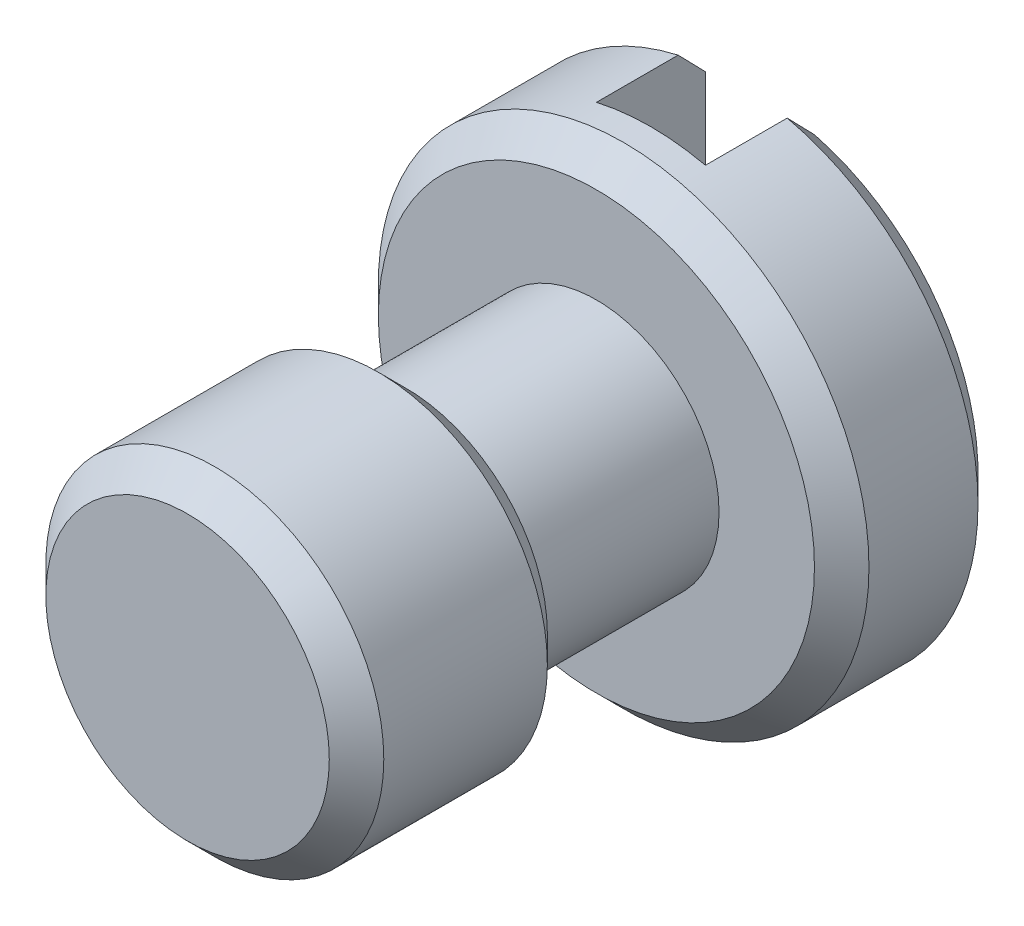
ISO-10303-21;
HEADER;
FILE_DESCRIPTION(('STEP AP214'),'2;1');
FILE_NAME('part.step','',(''),(''),'','','');
FILE_SCHEMA(('AUTOMOTIVE_DESIGN { 1 0 10303 214 1 1 1 1 }'));
ENDSEC;
DATA;
#1=APPLICATION_CONTEXT('core data for automotive mechanical design processes');
#2=APPLICATION_PROTOCOL_DEFINITION('international standard','automotive_design',2000,#1);
#3=PRODUCT_CONTEXT('',#1,'mechanical');
#4=PRODUCT('Part','Part','',(#3));
#5=PRODUCT_RELATED_PRODUCT_CATEGORY('part','',(#4));
#6=PRODUCT_DEFINITION_FORMATION('','',#4);
#7=PRODUCT_DEFINITION_CONTEXT('part definition',#1,'design');
#8=PRODUCT_DEFINITION('design','',#6,#7);
#9=PRODUCT_DEFINITION_SHAPE('','',#8);
#10=(LENGTH_UNIT() NAMED_UNIT(*) SI_UNIT(.MILLI.,.METRE.));
#11=(NAMED_UNIT(*) PLANE_ANGLE_UNIT() SI_UNIT($,.RADIAN.));
#12=(NAMED_UNIT(*) SI_UNIT($,.STERADIAN.) SOLID_ANGLE_UNIT());
#13=UNCERTAINTY_MEASURE_WITH_UNIT(LENGTH_MEASURE(1.E-05),#10,'distance_accuracy_value','');
#14=(GEOMETRIC_REPRESENTATION_CONTEXT(3) GLOBAL_UNCERTAINTY_ASSIGNED_CONTEXT((#13)) GLOBAL_UNIT_ASSIGNED_CONTEXT((#10,
#11,#12)) REPRESENTATION_CONTEXT('',''));
#15=CARTESIAN_POINT('',(0.,0.,0.));
#16=DIRECTION('',(0.,0.,1.));
#17=DIRECTION('',(1.,0.,0.));
#18=AXIS2_PLACEMENT_3D('',#15,#16,#17);
#19=CARTESIAN_POINT('',(0.,0.,0.));
#20=DIRECTION('',(0.,0.,1.));
#21=DIRECTION('',(1.,0.,0.));
#22=AXIS2_PLACEMENT_3D('',#19,#20,#21);
#23=PLANE('',#22);
#24=CARTESIAN_POINT('',(0.,0.,0.));
#25=DIRECTION('',(0.,0.,1.));
#26=DIRECTION('',(1.,0.,0.));
#27=AXIS2_PLACEMENT_3D('',#24,#25,#26);
#28=CIRCLE('',#27,4.);
#29=CARTESIAN_POINT('',(-1.,-3.87298334620742,0.));
#30=VERTEX_POINT('',#29);
#31=CARTESIAN_POINT('',(-1.,3.87298334620742,0.));
#32=VERTEX_POINT('',#31);
#33=EDGE_CURVE('E100',#30,#32,#28,.F.);
#34=ORIENTED_EDGE('',*,*,#33,.T.);
#35=DIRECTION('',(0.,1.,0.));
#36=VECTOR('',#35,1.);
#37=CARTESIAN_POINT('',(-0.999999999999999,5.26025718752988,0.));
#38=LINE('',#37,#36);
#39=EDGE_CURVE('E91',#30,#32,#38,.T.);
#40=ORIENTED_EDGE('',*,*,#39,.F.);
#41=EDGE_LOOP('',(#34,#40));
#42=FACE_BOUND('',#41,.T.);
#43=ADVANCED_FACE('F37',(#42),#23,.F.);
#44=CARTESIAN_POINT('',(0.,0.,0.499999999999998));
#45=DIRECTION('',(0.,0.,1.));
#46=DIRECTION('',(1.,0.,0.));
#47=AXIS2_PLACEMENT_3D('',#44,#45,#46);
#48=CONICAL_SURFACE('',#47,4.5,0.78539816339745);
#49=CARTESIAN_POINT('',(-1.,-9.85793617292837,5.90852691319598));
#50=CARTESIAN_POINT('',(-1.,-9.56237442151109,5.6144811321637));
#51=CARTESIAN_POINT('',(-1.,-9.26675191520062,5.32049636903783));
#52=CARTESIAN_POINT('',(-1.,-8.67529210254584,4.73267353319929));
#53=CARTESIAN_POINT('',(-1.,-8.37945477505455,4.43883548176585));
#54=CARTESIAN_POINT('',(-1.,-7.7866703565786,3.85053533934102));
#55=CARTESIAN_POINT('',(-1.,-7.48972256200697,3.55607395702668));
#56=CARTESIAN_POINT('',(-1.,-6.89551769319073,2.96753224754982));
#57=CARTESIAN_POINT('',(-1.,-6.59826065868668,2.67345188025609));
#58=CARTESIAN_POINT('',(-1.,-5.90895139215772,1.99264775862218));
#59=CARTESIAN_POINT('',(-1.,-5.51671868608893,1.60610643190042));
#60=CARTESIAN_POINT('',(-1.,-4.92710627577728,1.02742453462714));
#61=CARTESIAN_POINT('',(-1.,-4.73031891187514,0.834680626687702));
#62=CARTESIAN_POINT('',(-1.,-4.33617823211878,0.449788688416364));
#63=CARTESIAN_POINT('',(-1.,-4.13882494099004,0.257640632792583));
#64=CARTESIAN_POINT('',(-1.,-3.74376522051584,-0.125283801620298));
#65=CARTESIAN_POINT('',(-1.,-3.54606096991526,-0.316062427284985));
#66=CARTESIAN_POINT('',(-1.,-3.14928272628128,-0.696260764371286));
#67=CARTESIAN_POINT('',(-1.,-2.95020851510087,-0.885680249077593));
#68=CARTESIAN_POINT('',(-1.,-2.64991715446641,-1.16787728963103));
#69=CARTESIAN_POINT('',(-1.,-2.54957693792321,-1.26158710450678));
#70=CARTESIAN_POINT('',(-1.,-2.34808542437292,-1.44812966913844));
#71=CARTESIAN_POINT('',(-1.,-2.2469341406444,-1.54096243319922));
#72=CARTESIAN_POINT('',(-1.,-2.04350979155852,-1.72533825915247));
#73=CARTESIAN_POINT('',(-1.,-1.94123702852919,-1.81688165413537));
#74=CARTESIAN_POINT('',(-1.,-1.73501022473658,-1.99805038149405));
#75=CARTESIAN_POINT('',(-1.,-1.63105636453815,-2.08767591749399));
#76=CARTESIAN_POINT('',(-1.,-1.48409373104127,-2.21058009187432));
#77=CARTESIAN_POINT('',(-1.,-1.44220152267035,-2.24519272285741));
#78=CARTESIAN_POINT('',(-1.,-1.3579029949807,-2.31379212128095));
#79=CARTESIAN_POINT('',(-1.,-1.3154966496135,-2.34777885678916));
#80=CARTESIAN_POINT('',(-1.,-1.22997188470462,-2.41502945023296));
#81=CARTESIAN_POINT('',(-1.,-1.1868521821241,-2.44829168103734));
#82=CARTESIAN_POINT('',(-1.,-1.0998396905881,-2.51378802380165));
#83=CARTESIAN_POINT('',(-1.,-1.05594694800327,-2.54602219710555));
#84=CARTESIAN_POINT('',(-1.,-0.968014576797841,-2.60855692902137));
#85=CARTESIAN_POINT('',(-1.,-0.923992607867604,-2.63888219378704));
#86=CARTESIAN_POINT('',(-1.,-0.834796985206083,-2.69778515105398));
#87=CARTESIAN_POINT('',(-1.,-0.789623554177678,-2.72636317790671));
#88=CARTESIAN_POINT('',(-1.,-0.697974834409734,-2.78105804461526));
#89=CARTESIAN_POINT('',(-1.,-0.65150368535126,-2.80718175864326));
#90=CARTESIAN_POINT('',(-1.,-0.556864534569655,-2.85612105258849));
#91=CARTESIAN_POINT('',(-1.,-0.508698107176253,-2.87893960610086));
#92=CARTESIAN_POINT('',(-1.,-0.428840988039292,-2.91228321557917));
#93=CARTESIAN_POINT('',(-1.,-0.397738328932887,-2.92421118265269));
#94=CARTESIAN_POINT('',(-1.,-0.3347633523521,-2.9458689335167));
#95=CARTESIAN_POINT('',(-1.,-0.302890971575594,-2.95559853582696));
#96=CARTESIAN_POINT('',(-1.,-0.238630881535436,-2.97238653341976));
#97=CARTESIAN_POINT('',(-1.,-0.206247055640382,-2.97945957649905));
#98=CARTESIAN_POINT('',(-1.,-0.14097166311233,-2.99062396266952));
#99=CARTESIAN_POINT('',(-1.,-0.108080266942173,-2.9947162854729));
#100=CARTESIAN_POINT('',(-1.,-0.0416914707313624,-2.99968368188181));
#101=CARTESIAN_POINT('',(-1.,-0.00819136194350617,-3.00052354320493));
#102=CARTESIAN_POINT('',(-1.,0.0587154109330276,-2.99883838867144));
#103=CARTESIAN_POINT('',(-1.,0.0921220760974102,-2.99631341171128));
#104=CARTESIAN_POINT('',(-1.,0.191974252112123,-2.98387511988826));
#105=CARTESIAN_POINT('',(-1.,0.25784083226893,-2.96908401446633));
#106=CARTESIAN_POINT('',(-1.,0.369665497138172,-2.93483953822764));
#107=CARTESIAN_POINT('',(-1.,0.416358316271018,-2.91758864325046));
#108=CARTESIAN_POINT('',(-1.,0.508095591613279,-2.87909226152677));
#109=CARTESIAN_POINT('',(-1.,0.553138800333278,-2.85784382330241));
#110=CARTESIAN_POINT('',(-1.,0.641895614693957,-2.81232631259699));
#111=CARTESIAN_POINT('',(-1.,0.685602422993325,-2.78804423765853));
#112=CARTESIAN_POINT('',(-1.,0.771714277405453,-2.73733014157438));
#113=CARTESIAN_POINT('',(-1.,0.814119845659296,-2.71089899873175));
#114=CARTESIAN_POINT('',(-1.,0.905688597908477,-2.65135481618233));
#115=CARTESIAN_POINT('',(-1.,0.954637718221886,-2.6179147262578));
#116=CARTESIAN_POINT('',(-1.,1.05138190636077,-2.54939843331176));
#117=CARTESIAN_POINT('',(-1.,1.09917674320752,-2.51432190688009));
#118=CARTESIAN_POINT('',(-1.,1.24127456844926,-2.4072526515867));
#119=CARTESIAN_POINT('',(-1.,1.33422196359067,-2.3334669148993));
#120=CARTESIAN_POINT('',(-1.,1.51804413998964,-2.18293980995085));
#121=CARTESIAN_POINT('',(-1.,1.60891315012109,-2.10619150493486));
#122=CARTESIAN_POINT('',(-1.,1.78906488885363,-1.95093457495815));
#123=CARTESIAN_POINT('',(-1.,1.8783482620109,-1.87242669604139));
#124=CARTESIAN_POINT('',(-1.,2.05620615661809,-1.71387661040601));
#125=CARTESIAN_POINT('',(-1.,2.14477617509419,-1.63382937402265));
#126=CARTESIAN_POINT('',(-1.,2.32114034438397,-1.47286802355605));
#127=CARTESIAN_POINT('',(-1.,2.40893441456951,-1.39195382127552));
#128=CARTESIAN_POINT('',(-1.,2.58380060844835,-1.22962605728713));
#129=CARTESIAN_POINT('',(-1.,2.67087365397082,-1.14821348710987));
#130=CARTESIAN_POINT('',(-1.,2.8445719403038,-0.984918515140156));
#131=CARTESIAN_POINT('',(-1.,2.93119719656728,-0.903036129769324));
#132=CARTESIAN_POINT('',(-1.,3.16460399302723,-0.681481137183477));
#133=CARTESIAN_POINT('',(-1.,3.31106068978689,-0.541466458649309));
#134=CARTESIAN_POINT('',(-1.,3.60329723635222,-0.260732104050482));
#135=CARTESIAN_POINT('',(-1.,3.74907708231189,-0.120012423989279));
#136=CARTESIAN_POINT('',(-1.,4.18571153286566,0.302890079409293));
#137=CARTESIAN_POINT('',(-0.999999999999999,4.4758530682056,0.585808738686907));
#138=CARTESIAN_POINT('',(-0.999999999999999,5.05530511634378,1.15292713750434));
#139=CARTESIAN_POINT('',(-0.999999999999999,5.34461484268708,1.43712767870137));
#140=CARTESIAN_POINT('',(-0.999999999999999,5.92257427664614,2.00619136126627));
#141=CARTESIAN_POINT('',(-0.999999999999999,6.21122399292177,2.29105449384032));
#142=CARTESIAN_POINT('',(-0.999999999999999,6.78017826848888,2.85339416395759));
#143=CARTESIAN_POINT('',(-0.999999999999999,7.06049448822365,3.13085891104526));
#144=CARTESIAN_POINT('',(-0.999999999999999,7.62084181439533,3.6860785468287));
#145=CARTESIAN_POINT('',(-0.999999999999999,7.90087291958912,3.96383343677891));
#146=CARTESIAN_POINT('',(-0.999999999999999,8.46049813596802,4.51932350669459));
#147=CARTESIAN_POINT('',(-0.999999999999999,8.74009241716214,4.79705851542165));
#148=CARTESIAN_POINT('',(-0.999999999999999,9.29912145743649,5.35268630959134));
#149=CARTESIAN_POINT('',(-0.999999999999999,9.57855621728939,5.63057909425654));
#150=CARTESIAN_POINT('',(-0.999999999999999,9.85793617292837,5.90852691319598));
#151=B_SPLINE_CURVE_WITH_KNOTS('',3,(#49,#50,#51,#52,#53,#54,#55,#56,#57,#58,#59,#60,#61,#62,
#63,#64,#65,#66,#67,#68,#69,#70,#71,#72,#73,#74,#75,#76,#77,#78,#79,#80,#81,#82,#83,#84,#85,#86,
#87,#88,#89,#90,#91,#92,#93,#94,#95,#96,#97,#98,#99,#100,#101,#102,#103,#104,#105,#106,#107,
#108,#109,#110,#111,#112,#113,#114,#115,#116,#117,#118,#119,#120,#121,#122,#123,#124,#125,#126,
#127,#128,#129,#130,#131,#132,#133,#134,#135,#136,#137,#138,#139,#140,#141,#142,#143,#144,#145,
#146,#147,#148,#149,#150),.UNSPECIFIED.,.F.,.F.,(4,2,2,2,2,2,2,2,2,2,2,2,2,2,2,2,2,2,2,2,2,2,2,
2,2,2,2,2,2,2,2,2,2,2,2,2,2,2,2,2,2,2,2,2,2,2,2,2,2,2,4),(0.,1.25075062455364,2.50164812120299,
3.75622725917258,5.01066130272637,6.66273140298322,7.48909582014977,8.31542466723189,
9.13964944495778,9.96400865454135,10.3758878545813,10.7877603251593,11.1995243670932,
11.6112444718345,11.7742641929713,11.9372922082156,12.1006548851842,12.2640077960278,
12.4243460649613,12.5846535549057,12.7444977542279,12.9041972391706,13.0040661186486,
13.10394323953,13.2032612762674,13.3025466541011,13.4029039734918,13.5032601327938,
13.7045959078551,13.8537408526226,14.0029963497742,14.1529150538686,14.3027727926893,
14.4805690379227,14.6584005712549,15.0143129639268,15.3711163535886,15.7277712212828,
16.0859119954056,16.4440895561524,16.8017009361794,17.1592998917141,17.7671471054733,
18.3749977689305,19.5907322156859,20.8073784473467,22.0240086229594,23.2072559563648,
24.3905084269028,25.5727888992492,26.7550635955629),.UNSPECIFIED.);
#152=CARTESIAN_POINT('',(-1.,-4.38748219369606,0.499999999999998));
#153=VERTEX_POINT('',#152);
#154=EDGE_CURVE('E88',#153,#30,#151,.T.);
#155=ORIENTED_EDGE('',*,*,#154,.F.);
#156=CARTESIAN_POINT('',(0.,0.,0.499999999999998));
#157=DIRECTION('',(0.,0.,1.));
#158=DIRECTION('',(1.,0.,0.));
#159=AXIS2_PLACEMENT_3D('',#156,#157,#158);
#160=CIRCLE('',#159,4.5);
#161=CARTESIAN_POINT('',(-0.999999999999999,4.38748219369606,0.499999999999999));
#162=VERTEX_POINT('',#161);
#163=EDGE_CURVE('E299',#162,#153,#160,.T.);
#164=ORIENTED_EDGE('',*,*,#163,.F.);
#165=EDGE_CURVE('E97',#32,#162,#151,.T.);
#166=ORIENTED_EDGE('',*,*,#165,.F.);
#167=ORIENTED_EDGE('',*,*,#33,.F.);
#168=EDGE_LOOP('',(#155,#164,#166,#167));
#169=FACE_BOUND('',#168,.T.);
#170=ADVANCED_FACE('F102',(#169),#48,.T.);
#171=CARTESIAN_POINT('',(0.,0.,3.));
#172=DIRECTION('',(0.,0.,1.));
#173=DIRECTION('',(1.,0.,0.));
#174=AXIS2_PLACEMENT_3D('',#171,#172,#173);
#175=PLANE('',#174);
#176=CARTESIAN_POINT('',(0.,0.,3.));
#177=DIRECTION('',(0.,0.,1.));
#178=DIRECTION('',(1.,0.,0.));
#179=AXIS2_PLACEMENT_3D('',#176,#177,#178);
#180=CIRCLE('',#179,4.);
#181=CARTESIAN_POINT('',(4.,0.,3.));
#182=VERTEX_POINT('',#181);
#183=EDGE_CURVE('E297',#182,#182,#180,.T.);
#184=ORIENTED_EDGE('',*,*,#183,.T.);
#185=EDGE_LOOP('',(#184));
#186=FACE_BOUND('',#185,.T.);
#187=CARTESIAN_POINT('',(0.,0.,3.));
#188=DIRECTION('',(0.,0.,1.));
#189=DIRECTION('',(1.,0.,0.));
#190=AXIS2_PLACEMENT_3D('',#187,#188,#189);
#191=CIRCLE('',#190,2.25);
#192=CARTESIAN_POINT('',(2.25,0.,3.));
#193=VERTEX_POINT('',#192);
#194=EDGE_CURVE('E279',#193,#193,#191,.T.);
#195=ORIENTED_EDGE('',*,*,#194,.F.);
#196=EDGE_LOOP('',(#195));
#197=FACE_BOUND('',#196,.T.);
#198=ADVANCED_FACE('F146',(#186,#197),#175,.T.);
#199=CARTESIAN_POINT('',(0.,0.,3.));
#200=DIRECTION('',(0.,0.,-1.));
#201=DIRECTION('',(-1.,0.,0.));
#202=AXIS2_PLACEMENT_3D('',#199,#200,#201);
#203=CYLINDRICAL_SURFACE('',#202,4.5);
#204=CARTESIAN_POINT('',(0.,0.,2.));
#205=DIRECTION('',(0.,0.,-1.));
#206=DIRECTION('',(-1.,0.,0.));
#207=AXIS2_PLACEMENT_3D('',#204,#205,#206);
#208=CIRCLE('',#207,4.5);
#209=CARTESIAN_POINT('',(-0.999999999999999,4.38748219369606,2.));
#210=VERTEX_POINT('',#209);
#211=CARTESIAN_POINT('',(1.,4.38748219369606,2.));
#212=VERTEX_POINT('',#211);
#213=EDGE_CURVE('E11',#210,#212,#208,.T.);
#214=ORIENTED_EDGE('',*,*,#213,.F.);
#215=DIRECTION('',(0.,0.,-1.));
#216=VECTOR('',#215,1.);
#217=CARTESIAN_POINT('',(-0.999999999999999,4.38748219369606,3.));
#218=LINE('',#217,#216);
#219=EDGE_CURVE('E272',#210,#162,#218,.T.);
#220=ORIENTED_EDGE('',*,*,#219,.T.);
#221=ORIENTED_EDGE('',*,*,#163,.T.);
#222=DIRECTION('',(0.,0.,-1.));
#223=VECTOR('',#222,1.);
#224=CARTESIAN_POINT('',(-1.,-4.38748219369606,3.));
#225=LINE('',#224,#223);
#226=CARTESIAN_POINT('',(-1.,-4.38748219369606,2.));
#227=VERTEX_POINT('',#226);
#228=EDGE_CURVE('E61',#153,#227,#225,.F.);
#229=ORIENTED_EDGE('',*,*,#228,.T.);
#230=CARTESIAN_POINT('',(0.999999999999999,-4.38748219369606,2.));
#231=VERTEX_POINT('',#230);
#232=EDGE_CURVE('E42',#231,#227,#208,.T.);
#233=ORIENTED_EDGE('',*,*,#232,.F.);
#234=DIRECTION('',(0.,0.,-1.));
#235=VECTOR('',#234,1.);
#236=CARTESIAN_POINT('',(0.999999999999999,-4.38748219369606,3.));
#237=LINE('',#236,#235);
#238=CARTESIAN_POINT('',(0.999999999999999,-4.38748219369606,0.499999999999999));
#239=VERTEX_POINT('',#238);
#240=EDGE_CURVE('E266',#231,#239,#237,.T.);
#241=ORIENTED_EDGE('',*,*,#240,.T.);
#242=CARTESIAN_POINT('',(1.,4.38748219369606,0.499999999999998));
#243=VERTEX_POINT('',#242);
#244=EDGE_CURVE('E271',#239,#243,#160,.T.);
#245=ORIENTED_EDGE('',*,*,#244,.T.);
#246=DIRECTION('',(0.,0.,-1.));
#247=VECTOR('',#246,1.);
#248=CARTESIAN_POINT('',(1.,4.38748219369606,3.));
#249=LINE('',#248,#247);
#250=EDGE_CURVE('E263',#243,#212,#249,.F.);
#251=ORIENTED_EDGE('',*,*,#250,.T.);
#252=EDGE_LOOP('',(#214,#220,#221,#229,#233,#241,#245,#251));
#253=FACE_BOUND('',#252,.T.);
#254=CARTESIAN_POINT('',(0.,0.,2.5));
#255=DIRECTION('',(0.,0.,1.));
#256=DIRECTION('',(1.,0.,0.));
#257=AXIS2_PLACEMENT_3D('',#254,#255,#256);
#258=CIRCLE('',#257,4.5);
#259=CARTESIAN_POINT('',(4.5,0.,2.5));
#260=VERTEX_POINT('',#259);
#261=EDGE_CURVE('E109',#260,#260,#258,.F.);
#262=ORIENTED_EDGE('',*,*,#261,.T.);
#263=EDGE_LOOP('',(#262));
#264=FACE_BOUND('',#263,.T.);
#265=ADVANCED_FACE('F149',(#253,#264),#203,.T.);
#266=CARTESIAN_POINT('',(1.,3.87298334620742,0.));
#267=VERTEX_POINT('',#266);
#268=CARTESIAN_POINT('',(1.,-3.87298334620742,0.));
#269=VERTEX_POINT('',#268);
#270=EDGE_CURVE('E104',#267,#269,#28,.F.);
#271=ORIENTED_EDGE('',*,*,#270,.T.);
#272=DIRECTION('',(0.,-1.,0.));
#273=VECTOR('',#272,1.);
#274=CARTESIAN_POINT('',(1.,5.26025718752987,0.));
#275=LINE('',#274,#273);
#276=EDGE_CURVE('E53',#267,#269,#275,.T.);
#277=ORIENTED_EDGE('',*,*,#276,.F.);
#278=EDGE_LOOP('',(#271,#277));
#279=FACE_BOUND('',#278,.T.);
#280=ADVANCED_FACE('F144',(#279),#23,.F.);
#281=CARTESIAN_POINT('',(0.,0.,6.5));
#282=DIRECTION('',(0.,0.,-1.));
#283=DIRECTION('',(-1.,0.,0.));
#284=AXIS2_PLACEMENT_3D('',#281,#282,#283);
#285=CYLINDRICAL_SURFACE('',#284,2.25);
#286=CARTESIAN_POINT('',(0.,0.,6.5));
#287=DIRECTION('',(0.,0.,1.));
#288=DIRECTION('',(1.,0.,0.));
#289=AXIS2_PLACEMENT_3D('',#286,#287,#288);
#290=CIRCLE('',#289,2.25);
#291=CARTESIAN_POINT('',(2.25,0.,6.5));
#292=VERTEX_POINT('',#291);
#293=EDGE_CURVE('E280',#292,#292,#290,.T.);
#294=ORIENTED_EDGE('',*,*,#293,.F.);
#295=EDGE_LOOP('',(#294));
#296=FACE_BOUND('',#295,.T.);
#297=ORIENTED_EDGE('',*,*,#194,.T.);
#298=EDGE_LOOP('',(#297));
#299=FACE_BOUND('',#298,.T.);
#300=ADVANCED_FACE('F137',(#296,#299),#285,.T.);
#301=CARTESIAN_POINT('',(0.,0.,6.5));
#302=DIRECTION('',(0.,0.,1.));
#303=DIRECTION('',(1.,0.,0.));
#304=AXIS2_PLACEMENT_3D('',#301,#302,#303);
#305=PLANE('',#304);
#306=CARTESIAN_POINT('',(0.,0.,6.5));
#307=DIRECTION('',(0.,0.,1.));
#308=DIRECTION('',(1.,0.,0.));
#309=AXIS2_PLACEMENT_3D('',#306,#307,#308);
#310=CIRCLE('',#309,2.6);
#311=CARTESIAN_POINT('',(2.6,0.,6.5));
#312=VERTEX_POINT('',#311);
#313=EDGE_CURVE('E294',#312,#312,#310,.F.);
#314=ORIENTED_EDGE('',*,*,#313,.T.);
#315=EDGE_LOOP('',(#314));
#316=FACE_BOUND('',#315,.T.);
#317=ORIENTED_EDGE('',*,*,#293,.T.);
#318=EDGE_LOOP('',(#317));
#319=FACE_BOUND('',#318,.T.);
#320=ADVANCED_FACE('F134',(#316,#319),#305,.F.);
#321=CARTESIAN_POINT('',(0.,0.,10.5));
#322=DIRECTION('',(0.,0.,-1.));
#323=DIRECTION('',(-1.,0.,0.));
#324=AXIS2_PLACEMENT_3D('',#321,#322,#323);
#325=CYLINDRICAL_SURFACE('',#324,3.1);
#326=CARTESIAN_POINT('',(0.,0.,10.));
#327=DIRECTION('',(0.,0.,1.));
#328=DIRECTION('',(1.,0.,0.));
#329=AXIS2_PLACEMENT_3D('',#326,#327,#328);
#330=CIRCLE('',#329,3.1);
#331=CARTESIAN_POINT('',(3.1,0.,10.));
#332=VERTEX_POINT('',#331);
#333=EDGE_CURVE('E291',#332,#332,#330,.F.);
#334=ORIENTED_EDGE('',*,*,#333,.T.);
#335=EDGE_LOOP('',(#334));
#336=FACE_BOUND('',#335,.T.);
#337=CARTESIAN_POINT('',(0.,0.,7.));
#338=DIRECTION('',(0.,0.,1.));
#339=DIRECTION('',(1.,0.,0.));
#340=AXIS2_PLACEMENT_3D('',#337,#338,#339);
#341=CIRCLE('',#340,3.1);
#342=CARTESIAN_POINT('',(3.1,0.,7.));
#343=VERTEX_POINT('',#342);
#344=EDGE_CURVE('E288',#343,#343,#341,.T.);
#345=ORIENTED_EDGE('',*,*,#344,.T.);
#346=EDGE_LOOP('',(#345));
#347=FACE_BOUND('',#346,.T.);
#348=ADVANCED_FACE('F132',(#336,#347),#325,.T.);
#349=CARTESIAN_POINT('',(0.,0.,10.5));
#350=DIRECTION('',(0.,0.,1.));
#351=DIRECTION('',(1.,0.,0.));
#352=AXIS2_PLACEMENT_3D('',#349,#350,#351);
#353=PLANE('',#352);
#354=CARTESIAN_POINT('',(0.,0.,10.5));
#355=DIRECTION('',(0.,0.,1.));
#356=DIRECTION('',(1.,0.,0.));
#357=AXIS2_PLACEMENT_3D('',#354,#355,#356);
#358=CIRCLE('',#357,2.6);
#359=CARTESIAN_POINT('',(2.6,0.,10.5));
#360=VERTEX_POINT('',#359);
#361=EDGE_CURVE('E283',#360,#360,#358,.T.);
#362=ORIENTED_EDGE('',*,*,#361,.T.);
#363=EDGE_LOOP('',(#362));
#364=FACE_BOUND('',#363,.T.);
#365=ADVANCED_FACE('F128',(#364),#353,.T.);
#366=CARTESIAN_POINT('',(0.,0.,10.5));
#367=DIRECTION('',(0.,0.,-1.));
#368=DIRECTION('',(-1.,0.,0.));
#369=AXIS2_PLACEMENT_3D('',#366,#367,#368);
#370=CONICAL_SURFACE('',#369,2.6,0.785398163397448);
#371=ORIENTED_EDGE('',*,*,#333,.F.);
#372=EDGE_LOOP('',(#371));
#373=FACE_BOUND('',#372,.T.);
#374=ORIENTED_EDGE('',*,*,#361,.F.);
#375=EDGE_LOOP('',(#374));
#376=FACE_BOUND('',#375,.T.);
#377=ADVANCED_FACE('F131',(#373,#376),#370,.T.);
#378=CARTESIAN_POINT('',(0.,0.,7.));
#379=DIRECTION('',(0.,0.,1.));
#380=DIRECTION('',(1.,0.,0.));
#381=AXIS2_PLACEMENT_3D('',#378,#379,#380);
#382=CONICAL_SURFACE('',#381,3.1,0.785398163397451);
#383=ORIENTED_EDGE('',*,*,#313,.F.);
#384=EDGE_LOOP('',(#383));
#385=FACE_BOUND('',#384,.T.);
#386=ORIENTED_EDGE('',*,*,#344,.F.);
#387=EDGE_LOOP('',(#386));
#388=FACE_BOUND('',#387,.T.);
#389=ADVANCED_FACE('F159',(#385,#388),#382,.T.);
#390=CARTESIAN_POINT('',(0.,0.,3.));
#391=DIRECTION('',(0.,0.,-1.));
#392=DIRECTION('',(-1.,0.,0.));
#393=AXIS2_PLACEMENT_3D('',#390,#391,#392);
#394=CONICAL_SURFACE('',#393,4.,0.785398163397447);
#395=ORIENTED_EDGE('',*,*,#261,.F.);
#396=EDGE_LOOP('',(#395));
#397=FACE_BOUND('',#396,.T.);
#398=ORIENTED_EDGE('',*,*,#183,.F.);
#399=EDGE_LOOP('',(#398));
#400=FACE_BOUND('',#399,.T.);
#401=ADVANCED_FACE('F162',(#397,#400),#394,.T.);
#402=CARTESIAN_POINT('',(1.,9.85793617292836,5.90852691319598));
#403=CARTESIAN_POINT('',(1.,9.56237442151108,5.6144811321637));
#404=CARTESIAN_POINT('',(1.,9.26675191520062,5.32049636903783));
#405=CARTESIAN_POINT('',(1.,8.67529210254584,4.73267353319929));
#406=CARTESIAN_POINT('',(1.,8.37945477505455,4.43883548176586));
#407=CARTESIAN_POINT('',(1.,7.7866703565786,3.85053533934103));
#408=CARTESIAN_POINT('',(1.,7.48972256200697,3.55607395702668));
#409=CARTESIAN_POINT('',(1.,6.89551769319074,2.96753224754982));
#410=CARTESIAN_POINT('',(1.,6.59826065868668,2.67345188025609));
#411=CARTESIAN_POINT('',(1.,5.90895139215772,1.99264775862218));
#412=CARTESIAN_POINT('',(1.,5.51671868608893,1.60610643190042));
#413=CARTESIAN_POINT('',(1.,4.92710627577729,1.02742453462714));
#414=CARTESIAN_POINT('',(1.,4.73031891187514,0.834680626687703));
#415=CARTESIAN_POINT('',(1.,4.33617823211878,0.449788688416365));
#416=CARTESIAN_POINT('',(1.,4.13882494099004,0.257640632792585));
#417=CARTESIAN_POINT('',(1.,3.74376522051584,-0.125283801620296));
#418=CARTESIAN_POINT('',(1.,3.54606096991526,-0.316062427284985));
#419=CARTESIAN_POINT('',(1.,3.14928272628128,-0.696260764371285));
#420=CARTESIAN_POINT('',(1.,2.95020851510087,-0.885680249077592));
#421=CARTESIAN_POINT('',(1.,2.64991715446641,-1.16787728963103));
#422=CARTESIAN_POINT('',(1.,2.54957693792321,-1.26158710450678));
#423=CARTESIAN_POINT('',(1.,2.34808542437292,-1.44812966913844));
#424=CARTESIAN_POINT('',(1.,2.2469341406444,-1.54096243319922));
#425=CARTESIAN_POINT('',(1.,2.04350979155852,-1.72533825915248));
#426=CARTESIAN_POINT('',(1.,1.94123702852919,-1.81688165413537));
#427=CARTESIAN_POINT('',(1.,1.73501022473658,-1.99805038149405));
#428=CARTESIAN_POINT('',(1.,1.63105636453815,-2.08767591749399));
#429=CARTESIAN_POINT('',(1.,1.48409373104127,-2.21058009187432));
#430=CARTESIAN_POINT('',(1.,1.44220152267035,-2.24519272285741));
#431=CARTESIAN_POINT('',(1.,1.35790299498069,-2.31379212128095));
#432=CARTESIAN_POINT('',(1.,1.3154966496135,-2.34777885678916));
#433=CARTESIAN_POINT('',(1.,1.22997188470462,-2.41502945023296));
#434=CARTESIAN_POINT('',(1.,1.1868521821241,-2.44829168103735));
#435=CARTESIAN_POINT('',(1.,1.0998396905881,-2.51378802380165));
#436=CARTESIAN_POINT('',(1.,1.05594694800327,-2.54602219710555));
#437=CARTESIAN_POINT('',(1.,0.968014576797839,-2.60855692902137));
#438=CARTESIAN_POINT('',(1.,0.923992607867603,-2.63888219378704));
#439=CARTESIAN_POINT('',(1.,0.834796985206082,-2.69778515105398));
#440=CARTESIAN_POINT('',(1.,0.789623554177678,-2.72636317790671));
#441=CARTESIAN_POINT('',(1.,0.697974834409735,-2.78105804461526));
#442=CARTESIAN_POINT('',(1.,0.651503685351261,-2.80718175864326));
#443=CARTESIAN_POINT('',(1.,0.556864534569656,-2.85612105258849));
#444=CARTESIAN_POINT('',(1.,0.508698107176253,-2.87893960610086));
#445=CARTESIAN_POINT('',(1.,0.428840988039292,-2.91228321557917));
#446=CARTESIAN_POINT('',(1.,0.397738328932886,-2.92421118265269));
#447=CARTESIAN_POINT('',(1.,0.334763352352098,-2.9458689335167));
#448=CARTESIAN_POINT('',(1.,0.302890971575593,-2.95559853582696));
#449=CARTESIAN_POINT('',(1.,0.238630881535436,-2.97238653341976));
#450=CARTESIAN_POINT('',(1.,0.206247055640382,-2.97945957649905));
#451=CARTESIAN_POINT('',(1.,0.14097166311233,-2.99062396266952));
#452=CARTESIAN_POINT('',(1.,0.108080266942173,-2.9947162854729));
#453=CARTESIAN_POINT('',(1.,0.0416914707313636,-2.99968368188181));
#454=CARTESIAN_POINT('',(1.,0.00819136194350786,-3.00052354320493));
#455=CARTESIAN_POINT('',(1.,-0.0587154109330252,-2.99883838867144));
#456=CARTESIAN_POINT('',(1.,-0.0921220760974079,-2.99631341171128));
#457=CARTESIAN_POINT('',(1.,-0.191974252112121,-2.98387511988826));
#458=CARTESIAN_POINT('',(1.,-0.257840832268929,-2.96908401446633));
#459=CARTESIAN_POINT('',(1.,-0.369665497138171,-2.93483953822764));
#460=CARTESIAN_POINT('',(1.,-0.416358316271018,-2.91758864325046));
#461=CARTESIAN_POINT('',(1.,-0.508095591613279,-2.87909226152677));
#462=CARTESIAN_POINT('',(1.,-0.553138800333278,-2.85784382330241));
#463=CARTESIAN_POINT('',(1.,-0.641895614693956,-2.81232631259699));
#464=CARTESIAN_POINT('',(1.,-0.685602422993324,-2.78804423765853));
#465=CARTESIAN_POINT('',(1.,-0.771714277405452,-2.73733014157438));
#466=CARTESIAN_POINT('',(1.,-0.814119845659295,-2.71089899873175));
#467=CARTESIAN_POINT('',(1.,-0.905688597908476,-2.65135481618233));
#468=CARTESIAN_POINT('',(1.,-0.954637718221885,-2.6179147262578));
#469=CARTESIAN_POINT('',(1.,-1.05138190636077,-2.54939843331176));
#470=CARTESIAN_POINT('',(1.,-1.09917674320752,-2.51432190688009));
#471=CARTESIAN_POINT('',(1.,-1.24127456844926,-2.4072526515867));
#472=CARTESIAN_POINT('',(1.,-1.33422196359067,-2.33346691489931));
#473=CARTESIAN_POINT('',(1.,-1.51804413998964,-2.18293980995085));
#474=CARTESIAN_POINT('',(1.,-1.60891315012109,-2.10619150493486));
#475=CARTESIAN_POINT('',(1.,-1.78906488885363,-1.95093457495815));
#476=CARTESIAN_POINT('',(1.,-1.8783482620109,-1.8724266960414));
#477=CARTESIAN_POINT('',(1.,-2.05620615661809,-1.71387661040601));
#478=CARTESIAN_POINT('',(1.,-2.14477617509419,-1.63382937402266));
#479=CARTESIAN_POINT('',(1.,-2.32114034438396,-1.47286802355605));
#480=CARTESIAN_POINT('',(1.,-2.40893441456951,-1.39195382127552));
#481=CARTESIAN_POINT('',(1.,-2.58380060844835,-1.22962605728713));
#482=CARTESIAN_POINT('',(1.,-2.67087365397082,-1.14821348710987));
#483=CARTESIAN_POINT('',(1.,-2.8445719403038,-0.984918515140156));
#484=CARTESIAN_POINT('',(1.,-2.93119719656728,-0.903036129769324));
#485=CARTESIAN_POINT('',(1.,-3.16460399302723,-0.681481137183477));
#486=CARTESIAN_POINT('',(1.,-3.31106068978689,-0.54146645864931));
#487=CARTESIAN_POINT('',(1.,-3.60329723635222,-0.260732104050483));
#488=CARTESIAN_POINT('',(1.,-3.74907708231189,-0.12001242398928));
#489=CARTESIAN_POINT('',(1.,-4.18571153286566,0.302890079409292));
#490=CARTESIAN_POINT('',(0.999999999999999,-4.4758530682056,0.585808738686906));
#491=CARTESIAN_POINT('',(0.999999999999999,-5.05530511634378,1.15292713750433));
#492=CARTESIAN_POINT('',(0.999999999999999,-5.34461484268708,1.43712767870137));
#493=CARTESIAN_POINT('',(0.999999999999999,-5.92257427664614,2.00619136126627));
#494=CARTESIAN_POINT('',(0.999999999999999,-6.21122399292176,2.29105449384032));
#495=CARTESIAN_POINT('',(0.999999999999999,-6.78017826848888,2.85339416395759));
#496=CARTESIAN_POINT('',(0.999999999999999,-7.06049448822365,3.13085891104525));
#497=CARTESIAN_POINT('',(0.999999999999999,-7.62084181439532,3.6860785468287));
#498=CARTESIAN_POINT('',(0.999999999999999,-7.90087291958912,3.96383343677891));
#499=CARTESIAN_POINT('',(0.999999999999999,-8.46049813596802,4.51932350669459));
#500=CARTESIAN_POINT('',(0.999999999999999,-8.74009241716214,4.79705851542165));
#501=CARTESIAN_POINT('',(0.999999999999999,-9.29912145743649,5.35268630959134));
#502=CARTESIAN_POINT('',(0.999999999999999,-9.57855621728939,5.63057909425654));
#503=CARTESIAN_POINT('',(0.999999999999999,-9.85793617292837,5.90852691319598));
#504=B_SPLINE_CURVE_WITH_KNOTS('',3,(#402,#403,#404,#405,#406,#407,#408,#409,#410,#411,#412,
#413,#414,#415,#416,#417,#418,#419,#420,#421,#422,#423,#424,#425,#426,#427,#428,#429,#430,#431,
#432,#433,#434,#435,#436,#437,#438,#439,#440,#441,#442,#443,#444,#445,#446,#447,#448,#449,#450,
#451,#452,#453,#454,#455,#456,#457,#458,#459,#460,#461,#462,#463,#464,#465,#466,#467,#468,#469,
#470,#471,#472,#473,#474,#475,#476,#477,#478,#479,#480,#481,#482,#483,#484,#485,#486,#487,#488,
#489,#490,#491,#492,#493,#494,#495,#496,#497,#498,#499,#500,#501,#502,#503),.UNSPECIFIED.,.F.,
.F.,(4,2,2,2,2,2,2,2,2,2,2,2,2,2,2,2,2,2,2,2,2,2,2,2,2,2,2,2,2,2,2,2,2,2,2,2,2,2,2,2,2,2,2,2,2,
2,2,2,2,2,4),(0.,1.25075062455364,2.50164812120299,3.75622725917257,5.01066130272636,
6.66273140298321,7.48909582014977,8.31542466723189,9.13964944495778,9.96400865454134,
10.3758878545813,10.7877603251593,11.1995243670932,11.6112444718345,11.7742641929713,
11.9372922082156,12.1006548851842,12.2640077960278,12.4243460649613,12.5846535549057,
12.7444977542279,12.9041972391706,13.0040661186486,13.10394323953,13.2032612762674,
13.3025466541011,13.4029039734918,13.5032601327938,13.7045959078551,13.8537408526226,
14.0029963497742,14.1529150538686,14.3027727926893,14.4805690379227,14.6584005712549,
15.0143129639268,15.3711163535886,15.7277712212828,16.0859119954056,16.4440895561524,
16.8017009361794,17.1592998917141,17.7671471054733,18.3749977689305,19.5907322156859,
20.8073784473467,22.0240086229594,23.2072559563648,24.3905084269028,25.5727888992492,
26.7550635955629),.UNSPECIFIED.);
#505=EDGE_CURVE('E106',#243,#267,#504,.T.);
#506=ORIENTED_EDGE('',*,*,#505,.F.);
#507=ORIENTED_EDGE('',*,*,#244,.F.);
#508=EDGE_CURVE('E103',#269,#239,#504,.T.);
#509=ORIENTED_EDGE('',*,*,#508,.F.);
#510=ORIENTED_EDGE('',*,*,#270,.F.);
#511=EDGE_LOOP('',(#506,#507,#509,#510));
#512=FACE_BOUND('',#511,.T.);
#513=ADVANCED_FACE('F39',(#512),#48,.T.);
#514=CARTESIAN_POINT('',(0.,0.,2.));
#515=DIRECTION('',(0.,0.,-1.));
#516=DIRECTION('',(-1.,0.,0.));
#517=AXIS2_PLACEMENT_3D('',#514,#515,#516);
#518=PLANE('',#517);
#519=ORIENTED_EDGE('',*,*,#213,.T.);
#520=DIRECTION('',(0.,-1.,0.));
#521=VECTOR('',#520,1.);
#522=CARTESIAN_POINT('',(1.,5.26025718752987,2.));
#523=LINE('',#522,#521);
#524=EDGE_CURVE('E258',#212,#231,#523,.T.);
#525=ORIENTED_EDGE('',*,*,#524,.T.);
#526=ORIENTED_EDGE('',*,*,#232,.T.);
#527=DIRECTION('',(0.,1.,0.));
#528=VECTOR('',#527,1.);
#529=CARTESIAN_POINT('',(-0.999999999999999,5.26025718752988,2.));
#530=LINE('',#529,#528);
#531=EDGE_CURVE('E260',#227,#210,#530,.T.);
#532=ORIENTED_EDGE('',*,*,#531,.T.);
#533=EDGE_LOOP('',(#519,#525,#526,#532));
#534=FACE_BOUND('',#533,.T.);
#535=ADVANCED_FACE('F124',(#534),#518,.T.);
#536=CARTESIAN_POINT('',(-0.999999999999999,5.26025718752988,2.));
#537=DIRECTION('',(-1.,0.,0.));
#538=DIRECTION('',(0.,-1.,0.));
#539=AXIS2_PLACEMENT_3D('',#536,#537,#538);
#540=PLANE('',#539);
#541=ORIENTED_EDGE('',*,*,#154,.T.);
#542=ORIENTED_EDGE('',*,*,#39,.T.);
#543=ORIENTED_EDGE('',*,*,#165,.T.);
#544=ORIENTED_EDGE('',*,*,#219,.F.);
#545=ORIENTED_EDGE('',*,*,#531,.F.);
#546=ORIENTED_EDGE('',*,*,#228,.F.);
#547=EDGE_LOOP('',(#541,#542,#543,#544,#545,#546));
#548=FACE_BOUND('',#547,.T.);
#549=ADVANCED_FACE('F90',(#548),#540,.F.);
#550=CARTESIAN_POINT('',(1.,5.26025718752987,2.));
#551=DIRECTION('',(1.,0.,0.));
#552=DIRECTION('',(0.,1.,0.));
#553=AXIS2_PLACEMENT_3D('',#550,#551,#552);
#554=PLANE('',#553);
#555=ORIENTED_EDGE('',*,*,#505,.T.);
#556=ORIENTED_EDGE('',*,*,#276,.T.);
#557=ORIENTED_EDGE('',*,*,#508,.T.);
#558=ORIENTED_EDGE('',*,*,#240,.F.);
#559=ORIENTED_EDGE('',*,*,#524,.F.);
#560=ORIENTED_EDGE('',*,*,#250,.F.);
#561=EDGE_LOOP('',(#555,#556,#557,#558,#559,#560));
#562=FACE_BOUND('',#561,.T.);
#563=ADVANCED_FACE('F120',(#562),#554,.F.);
#564=CLOSED_SHELL('',(#43,#170,#198,#265,#280,#300,#320,#348,#365,#377,#389,#401,#513,#535,#549,#563));
#565=MANIFOLD_SOLID_BREP('B2',#564);
#566=ADVANCED_BREP_SHAPE_REPRESENTATION('',(#18,#565),#14);
#567=SHAPE_DEFINITION_REPRESENTATION(#9,#566);
ENDSEC;
END-ISO-10303-21;
